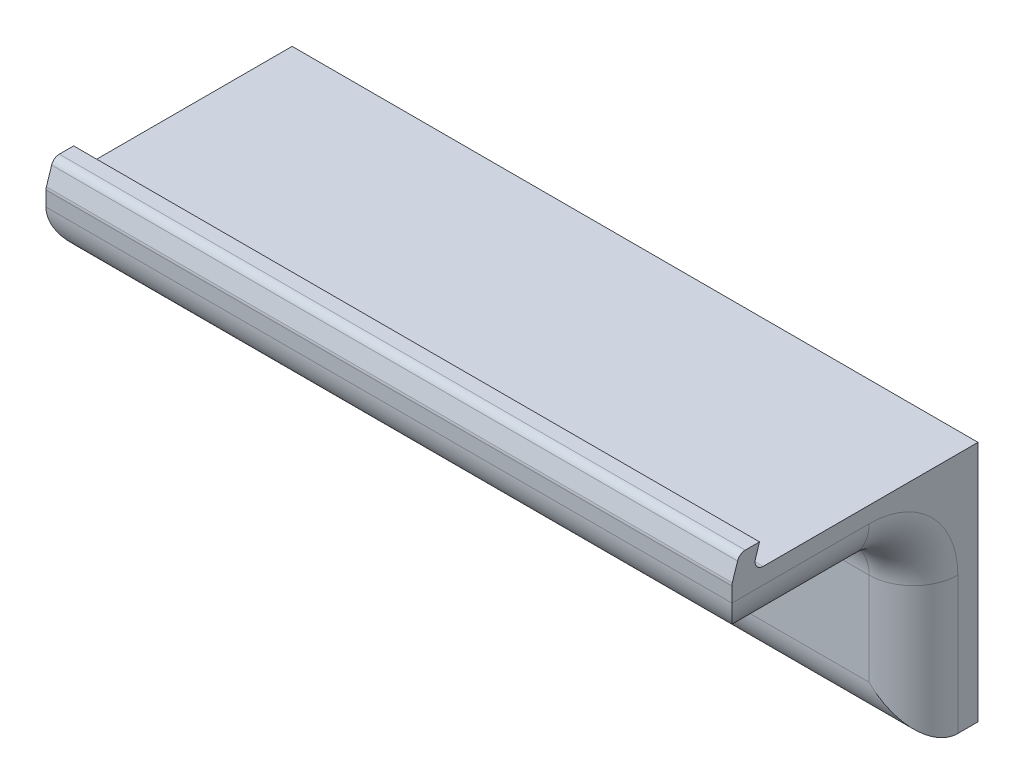
ISO-10303-21;
HEADER;
FILE_DESCRIPTION(('STEP AP214'),'2;1');
FILE_NAME('part.step','',(''),(''),'','','');
FILE_SCHEMA(('AUTOMOTIVE_DESIGN { 1 0 10303 214 1 1 1 1 }'));
ENDSEC;
DATA;
#1=APPLICATION_CONTEXT('core data for automotive mechanical design processes');
#2=APPLICATION_PROTOCOL_DEFINITION('international standard','automotive_design',2000,#1);
#3=PRODUCT_CONTEXT('',#1,'mechanical');
#4=PRODUCT('Part','Part','',(#3));
#5=PRODUCT_RELATED_PRODUCT_CATEGORY('part','',(#4));
#6=PRODUCT_DEFINITION_FORMATION('','',#4);
#7=PRODUCT_DEFINITION_CONTEXT('part definition',#1,'design');
#8=PRODUCT_DEFINITION('design','',#6,#7);
#9=PRODUCT_DEFINITION_SHAPE('','',#8);
#10=(LENGTH_UNIT() NAMED_UNIT(*) SI_UNIT(.MILLI.,.METRE.));
#11=(NAMED_UNIT(*) PLANE_ANGLE_UNIT() SI_UNIT($,.RADIAN.));
#12=(NAMED_UNIT(*) SI_UNIT($,.STERADIAN.) SOLID_ANGLE_UNIT());
#13=UNCERTAINTY_MEASURE_WITH_UNIT(LENGTH_MEASURE(1.E-05),#10,'distance_accuracy_value','');
#14=(GEOMETRIC_REPRESENTATION_CONTEXT(3) GLOBAL_UNCERTAINTY_ASSIGNED_CONTEXT((#13)) GLOBAL_UNIT_ASSIGNED_CONTEXT((#10,
#11,#12)) REPRESENTATION_CONTEXT('',''));
#15=CARTESIAN_POINT('',(0.,0.,0.));
#16=DIRECTION('',(0.,0.,1.));
#17=DIRECTION('',(1.,0.,0.));
#18=AXIS2_PLACEMENT_3D('',#15,#16,#17);
#19=CARTESIAN_POINT('',(-42.5,15.,8.));
#20=DIRECTION('',(0.,-1.,0.));
#21=DIRECTION('',(0.,0.,-1.));
#22=AXIS2_PLACEMENT_3D('',#19,#20,#21);
#23=PLANE('',#22);
#24=DIRECTION('',(0.,0.,-1.));
#25=VECTOR('',#24,1.);
#26=CARTESIAN_POINT('',(-42.5,15.,8.));
#27=LINE('',#26,#25);
#28=CARTESIAN_POINT('',(-42.5,15.,26.6236180795288));
#29=VERTEX_POINT('',#28);
#30=CARTESIAN_POINT('',(-42.5,15.,0.));
#31=VERTEX_POINT('',#30);
#32=EDGE_CURVE('E246',#29,#31,#27,.T.);
#33=ORIENTED_EDGE('',*,*,#32,.F.);
#34=DIRECTION('',(-1.,0.,0.));
#35=VECTOR('',#34,1.);
#36=CARTESIAN_POINT('',(-42.5,15.,26.6236180795288));
#37=LINE('',#36,#35);
#38=CARTESIAN_POINT('',(42.5,15.,26.6236180795288));
#39=VERTEX_POINT('',#38);
#40=EDGE_CURVE('E346',#29,#39,#37,.F.);
#41=ORIENTED_EDGE('',*,*,#40,.T.);
#42=DIRECTION('',(0.,0.,-1.));
#43=VECTOR('',#42,1.);
#44=CARTESIAN_POINT('',(42.5,15.,8.));
#45=LINE('',#44,#43);
#46=CARTESIAN_POINT('',(42.5,15.,0.));
#47=VERTEX_POINT('',#46);
#48=EDGE_CURVE('E249',#39,#47,#45,.T.);
#49=ORIENTED_EDGE('',*,*,#48,.T.);
#50=DIRECTION('',(-1.,0.,0.));
#51=VECTOR('',#50,1.);
#52=CARTESIAN_POINT('',(-42.5,15.,0.));
#53=LINE('',#52,#51);
#54=EDGE_CURVE('E228',#47,#31,#53,.T.);
#55=ORIENTED_EDGE('',*,*,#54,.T.);
#56=EDGE_LOOP('',(#33,#41,#49,#55));
#57=FACE_BOUND('',#56,.T.);
#58=ADVANCED_FACE('F41',(#57),#23,.F.);
#59=CARTESIAN_POINT('',(0.,0.,8.));
#60=DIRECTION('',(0.,0.,-1.));
#61=DIRECTION('',(-1.,0.,0.));
#62=AXIS2_PLACEMENT_3D('',#59,#60,#61);
#63=PLANE('',#62);
#64=DIRECTION('',(1.,0.,0.));
#65=VECTOR('',#64,1.);
#66=CARTESIAN_POINT('',(-42.5,2.,8.));
#67=LINE('',#66,#65);
#68=CARTESIAN_POINT('',(37.,2.,8.));
#69=VERTEX_POINT('',#68);
#70=CARTESIAN_POINT('',(-37.,2.,8.));
#71=VERTEX_POINT('',#70);
#72=EDGE_CURVE('E276',#69,#71,#67,.F.);
#73=ORIENTED_EDGE('',*,*,#72,.T.);
#74=DIRECTION('',(0.,-1.,0.));
#75=VECTOR('',#74,1.);
#76=CARTESIAN_POINT('',(-37.,0.,8.));
#77=LINE('',#76,#75);
#78=CARTESIAN_POINT('',(-37.,-9.5,8.));
#79=VERTEX_POINT('',#78);
#80=EDGE_CURVE('E285',#71,#79,#77,.T.);
#81=ORIENTED_EDGE('',*,*,#80,.T.);
#82=DIRECTION('',(1.,0.,0.));
#83=VECTOR('',#82,1.);
#84=CARTESIAN_POINT('',(0.,-9.5,8.));
#85=LINE('',#84,#83);
#86=CARTESIAN_POINT('',(37.,-9.5,8.));
#87=VERTEX_POINT('',#86);
#88=EDGE_CURVE('E282',#79,#87,#85,.T.);
#89=ORIENTED_EDGE('',*,*,#88,.T.);
#90=DIRECTION('',(0.,1.,0.));
#91=VECTOR('',#90,1.);
#92=CARTESIAN_POINT('',(37.,0.,8.));
#93=LINE('',#92,#91);
#94=EDGE_CURVE('E279',#87,#69,#93,.T.);
#95=ORIENTED_EDGE('',*,*,#94,.T.);
#96=EDGE_LOOP('',(#73,#81,#89,#95));
#97=FACE_BOUND('',#96,.T.);
#98=CARTESIAN_POINT('',(-22.5,-3.75,8.));
#99=DIRECTION('',(0.,0.,1.));
#100=DIRECTION('',(1.,0.,0.));
#101=AXIS2_PLACEMENT_3D('',#98,#99,#100);
#102=CIRCLE('',#101,3.15);
#103=CARTESIAN_POINT('',(-19.35,-3.75,8.));
#104=VERTEX_POINT('',#103);
#105=EDGE_CURVE('E193',#104,#104,#102,.T.);
#106=ORIENTED_EDGE('',*,*,#105,.F.);
#107=EDGE_LOOP('',(#106));
#108=FACE_BOUND('',#107,.T.);
#109=CARTESIAN_POINT('',(22.5,-3.75,8.));
#110=DIRECTION('',(0.,0.,1.));
#111=DIRECTION('',(1.,0.,0.));
#112=AXIS2_PLACEMENT_3D('',#109,#110,#111);
#113=CIRCLE('',#112,3.15);
#114=CARTESIAN_POINT('',(25.65,-3.75,8.));
#115=VERTEX_POINT('',#114);
#116=EDGE_CURVE('E206',#115,#115,#113,.T.);
#117=ORIENTED_EDGE('',*,*,#116,.F.);
#118=EDGE_LOOP('',(#117));
#119=FACE_BOUND('',#118,.T.);
#120=ADVANCED_FACE('F392',(#97,#108,#119),#63,.F.);
#121=CARTESIAN_POINT('',(42.5,-15.,8.));
#122=DIRECTION('',(-1.,0.,0.));
#123=DIRECTION('',(0.,0.,1.));
#124=AXIS2_PLACEMENT_3D('',#121,#122,#123);
#125=PLANE('',#124);
#126=DIRECTION('',(0.,0.,1.));
#127=VECTOR('',#126,1.);
#128=CARTESIAN_POINT('',(42.5,17.8531695488855,27.0729490168752));
#129=LINE('',#128,#127);
#130=CARTESIAN_POINT('',(42.5,17.8531695488855,27.0729490168752));
#131=VERTEX_POINT('',#130);
#132=CARTESIAN_POINT('',(42.5,17.8531695488855,28.8464064888698));
#133=VERTEX_POINT('',#132);
#134=EDGE_CURVE('E177',#131,#133,#129,.T.);
#135=ORIENTED_EDGE('',*,*,#134,.T.);
#136=CARTESIAN_POINT('',(42.5,16.8531695488855,28.8464064888698));
#137=DIRECTION('',(-1.,0.,0.));
#138=DIRECTION('',(0.,0.,1.));
#139=AXIS2_PLACEMENT_3D('',#136,#137,#138);
#140=CIRCLE('',#139,1.);
#141=CARTESIAN_POINT('',(42.5,17.1621865432604,29.797463005165));
#142=VERTEX_POINT('',#141);
#143=EDGE_CURVE('E50',#133,#142,#140,.F.);
#144=ORIENTED_EDGE('',*,*,#143,.T.);
#145=DIRECTION('',(0.,-0.951056516295155,0.309016994374945));
#146=VECTOR('',#145,1.);
#147=CARTESIAN_POINT('',(42.5,15.,30.5));
#148=LINE('',#147,#146);
#149=CARTESIAN_POINT('',(42.5,15.1506325540504,30.4510565162952));
#150=VERTEX_POINT('',#149);
#151=EDGE_CURVE('E190',#142,#150,#148,.T.);
#152=ORIENTED_EDGE('',*,*,#151,.T.);
#153=CARTESIAN_POINT('',(42.5,14.8416155596755,29.5));
#154=DIRECTION('',(-1.,0.,0.));
#155=DIRECTION('',(0.,0.,1.));
#156=AXIS2_PLACEMENT_3D('',#153,#154,#155);
#157=CIRCLE('',#156,1.);
#158=CARTESIAN_POINT('',(42.5,14.8416155596755,30.5));
#159=VERTEX_POINT('',#158);
#160=EDGE_CURVE('E57',#150,#159,#157,.F.);
#161=ORIENTED_EDGE('',*,*,#160,.T.);
#162=DIRECTION('',(0.,1.,0.));
#163=VECTOR('',#162,1.);
#164=CARTESIAN_POINT('',(42.5,15.,30.5));
#165=LINE('',#164,#163);
#166=CARTESIAN_POINT('',(42.5,13.,30.5));
#167=VERTEX_POINT('',#166);
#168=EDGE_CURVE('E221',#167,#159,#165,.T.);
#169=ORIENTED_EDGE('',*,*,#168,.F.);
#170=DIRECTION('',(0.,0.,-1.));
#171=VECTOR('',#170,1.);
#172=CARTESIAN_POINT('',(42.5,13.,8.));
#173=LINE('',#172,#171);
#174=CARTESIAN_POINT('',(42.5,13.,13.5));
#175=VERTEX_POINT('',#174);
#176=EDGE_CURVE('E259',#167,#175,#173,.T.);
#177=ORIENTED_EDGE('',*,*,#176,.T.);
#178=CARTESIAN_POINT('',(42.5,2.,13.5));
#179=DIRECTION('',(-1.,0.,0.));
#180=DIRECTION('',(0.,0.,1.));
#181=AXIS2_PLACEMENT_3D('',#178,#179,#180);
#182=CIRCLE('',#181,11.);
#183=CARTESIAN_POINT('',(42.5,2.,2.5));
#184=VERTEX_POINT('',#183);
#185=EDGE_CURVE('E255',#184,#175,#182,.F.);
#186=ORIENTED_EDGE('',*,*,#185,.F.);
#187=DIRECTION('',(0.,1.,0.));
#188=VECTOR('',#187,1.);
#189=CARTESIAN_POINT('',(42.5,-15.,2.5));
#190=LINE('',#189,#188);
#191=CARTESIAN_POINT('',(42.5,-15.,2.5));
#192=VERTEX_POINT('',#191);
#193=EDGE_CURVE('E252',#184,#192,#190,.F.);
#194=ORIENTED_EDGE('',*,*,#193,.T.);
#195=DIRECTION('',(0.,0.,-1.));
#196=VECTOR('',#195,1.);
#197=CARTESIAN_POINT('',(42.5,-15.,8.));
#198=LINE('',#197,#196);
#199=CARTESIAN_POINT('',(42.5,-15.,0.));
#200=VERTEX_POINT('',#199);
#201=EDGE_CURVE('E240',#192,#200,#198,.T.);
#202=ORIENTED_EDGE('',*,*,#201,.T.);
#203=DIRECTION('',(0.,1.,0.));
#204=VECTOR('',#203,1.);
#205=CARTESIAN_POINT('',(42.5,-15.,0.));
#206=LINE('',#205,#204);
#207=EDGE_CURVE('E224',#200,#47,#206,.T.);
#208=ORIENTED_EDGE('',*,*,#207,.T.);
#209=ORIENTED_EDGE('',*,*,#48,.F.);
#210=CARTESIAN_POINT('',(42.5,16.,26.6236180795288));
#211=DIRECTION('',(-1.,0.,0.));
#212=DIRECTION('',(0.,0.,1.));
#213=AXIS2_PLACEMENT_3D('',#210,#211,#212);
#214=CIRCLE('',#213,1.);
#215=CARTESIAN_POINT('',(42.5,16.3090169943749,27.574674595824));
#216=VERTEX_POINT('',#215);
#217=EDGE_CURVE('E352',#39,#216,#214,.T.);
#218=ORIENTED_EDGE('',*,*,#217,.T.);
#219=DIRECTION('',(0.,0.951056516295154,-0.309016994374946));
#220=VECTOR('',#219,1.);
#221=CARTESIAN_POINT('',(42.5,15.,28.));
#222=LINE('',#221,#220);
#223=EDGE_CURVE('E194',#216,#131,#222,.T.);
#224=ORIENTED_EDGE('',*,*,#223,.T.);
#225=EDGE_LOOP('',(#135,#144,#152,#161,#169,#177,#186,#194,#202,#208,#209,#218,#224));
#226=FACE_BOUND('',#225,.T.);
#227=ADVANCED_FACE('F373',(#226),#125,.F.);
#228=CARTESIAN_POINT('',(-42.5,-15.,8.));
#229=DIRECTION('',(1.,0.,0.));
#230=DIRECTION('',(0.,0.,-1.));
#231=AXIS2_PLACEMENT_3D('',#228,#229,#230);
#232=PLANE('',#231);
#233=DIRECTION('',(0.,0.951056516295154,-0.309016994374945));
#234=VECTOR('',#233,1.);
#235=CARTESIAN_POINT('',(-42.5,15.,30.5));
#236=LINE('',#235,#234);
#237=CARTESIAN_POINT('',(-42.5,15.1506325540504,30.4510565162952));
#238=VERTEX_POINT('',#237);
#239=CARTESIAN_POINT('',(-42.5,17.1621865432604,29.797463005165));
#240=VERTEX_POINT('',#239);
#241=EDGE_CURVE('E172',#238,#240,#236,.T.);
#242=ORIENTED_EDGE('',*,*,#241,.T.);
#243=CARTESIAN_POINT('',(-42.5,16.8531695488855,28.8464064888698));
#244=DIRECTION('',(1.,0.,0.));
#245=DIRECTION('',(0.,0.,-1.));
#246=AXIS2_PLACEMENT_3D('',#243,#244,#245);
#247=CIRCLE('',#246,1.);
#248=CARTESIAN_POINT('',(-42.5,17.8531695488855,28.8464064888698));
#249=VERTEX_POINT('',#248);
#250=EDGE_CURVE('E170',#240,#249,#247,.F.);
#251=ORIENTED_EDGE('',*,*,#250,.T.);
#252=DIRECTION('',(0.,0.,-1.));
#253=VECTOR('',#252,1.);
#254=CARTESIAN_POINT('',(-42.5,17.8531695488855,27.0729490168752));
#255=LINE('',#254,#253);
#256=CARTESIAN_POINT('',(-42.5,17.8531695488855,27.0729490168752));
#257=VERTEX_POINT('',#256);
#258=EDGE_CURVE('E164',#249,#257,#255,.T.);
#259=ORIENTED_EDGE('',*,*,#258,.T.);
#260=DIRECTION('',(0.,-0.951056516295154,0.309016994374946));
#261=VECTOR('',#260,1.);
#262=CARTESIAN_POINT('',(-42.5,15.,28.));
#263=LINE('',#262,#261);
#264=CARTESIAN_POINT('',(-42.5,16.3090169943749,27.574674595824));
#265=VERTEX_POINT('',#264);
#266=EDGE_CURVE('E169',#257,#265,#263,.T.);
#267=ORIENTED_EDGE('',*,*,#266,.T.);
#268=CARTESIAN_POINT('',(-42.5,16.,26.6236180795288));
#269=DIRECTION('',(1.,0.,0.));
#270=DIRECTION('',(0.,0.,-1.));
#271=AXIS2_PLACEMENT_3D('',#268,#269,#270);
#272=CIRCLE('',#271,1.);
#273=EDGE_CURVE('E349',#265,#29,#272,.T.);
#274=ORIENTED_EDGE('',*,*,#273,.T.);
#275=ORIENTED_EDGE('',*,*,#32,.T.);
#276=DIRECTION('',(0.,-1.,0.));
#277=VECTOR('',#276,1.);
#278=CARTESIAN_POINT('',(-42.5,-15.,0.));
#279=LINE('',#278,#277);
#280=CARTESIAN_POINT('',(-42.5,-15.,0.));
#281=VERTEX_POINT('',#280);
#282=EDGE_CURVE('E232',#31,#281,#279,.T.);
#283=ORIENTED_EDGE('',*,*,#282,.T.);
#284=DIRECTION('',(0.,0.,-1.));
#285=VECTOR('',#284,1.);
#286=CARTESIAN_POINT('',(-42.5,-15.,8.));
#287=LINE('',#286,#285);
#288=CARTESIAN_POINT('',(-42.5,-15.,2.5));
#289=VERTEX_POINT('',#288);
#290=EDGE_CURVE('E243',#289,#281,#287,.T.);
#291=ORIENTED_EDGE('',*,*,#290,.F.);
#292=DIRECTION('',(0.,-1.,0.));
#293=VECTOR('',#292,1.);
#294=CARTESIAN_POINT('',(-42.5,-15.,2.5));
#295=LINE('',#294,#293);
#296=CARTESIAN_POINT('',(-42.5,2.,2.5));
#297=VERTEX_POINT('',#296);
#298=EDGE_CURVE('E297',#289,#297,#295,.F.);
#299=ORIENTED_EDGE('',*,*,#298,.T.);
#300=CARTESIAN_POINT('',(-42.5,2.,13.5));
#301=DIRECTION('',(1.,0.,0.));
#302=DIRECTION('',(0.,0.,-1.));
#303=AXIS2_PLACEMENT_3D('',#300,#301,#302);
#304=CIRCLE('',#303,11.);
#305=CARTESIAN_POINT('',(-42.5,13.,13.5));
#306=VERTEX_POINT('',#305);
#307=EDGE_CURVE('E293',#306,#297,#304,.F.);
#308=ORIENTED_EDGE('',*,*,#307,.F.);
#309=DIRECTION('',(0.,0.,-1.));
#310=VECTOR('',#309,1.);
#311=CARTESIAN_POINT('',(-42.5,13.,8.));
#312=LINE('',#311,#310);
#313=CARTESIAN_POINT('',(-42.5,13.,30.5));
#314=VERTEX_POINT('',#313);
#315=EDGE_CURVE('E289',#306,#314,#312,.F.);
#316=ORIENTED_EDGE('',*,*,#315,.T.);
#317=DIRECTION('',(0.,-1.,0.));
#318=VECTOR('',#317,1.);
#319=CARTESIAN_POINT('',(-42.5,15.,30.5));
#320=LINE('',#319,#318);
#321=CARTESIAN_POINT('',(-42.5,14.8416155596755,30.5));
#322=VERTEX_POINT('',#321);
#323=EDGE_CURVE('E218',#322,#314,#320,.T.);
#324=ORIENTED_EDGE('',*,*,#323,.F.);
#325=CARTESIAN_POINT('',(-42.5,14.8416155596755,29.5));
#326=DIRECTION('',(1.,0.,0.));
#327=DIRECTION('',(0.,0.,-1.));
#328=AXIS2_PLACEMENT_3D('',#325,#326,#327);
#329=CIRCLE('',#328,1.);
#330=EDGE_CURVE('E362',#322,#238,#329,.F.);
#331=ORIENTED_EDGE('',*,*,#330,.T.);
#332=EDGE_LOOP('',(#242,#251,#259,#267,#274,#275,#283,#291,#299,#308,#316,#324,#331));
#333=FACE_BOUND('',#332,.T.);
#334=ADVANCED_FACE('F167',(#333),#232,.F.);
#335=CARTESIAN_POINT('',(-42.5,-15.,8.));
#336=DIRECTION('',(0.,1.,0.));
#337=DIRECTION('',(0.,0.,1.));
#338=AXIS2_PLACEMENT_3D('',#335,#336,#337);
#339=PLANE('',#338);
#340=ORIENTED_EDGE('',*,*,#201,.F.);
#341=DIRECTION('',(1.,0.,0.));
#342=VECTOR('',#341,1.);
#343=CARTESIAN_POINT('',(-42.5,-15.,2.5));
#344=LINE('',#343,#342);
#345=EDGE_CURVE('E300',#192,#289,#344,.F.);
#346=ORIENTED_EDGE('',*,*,#345,.T.);
#347=ORIENTED_EDGE('',*,*,#290,.T.);
#348=DIRECTION('',(1.,0.,0.));
#349=VECTOR('',#348,1.);
#350=CARTESIAN_POINT('',(-42.5,-15.,0.));
#351=LINE('',#350,#349);
#352=EDGE_CURVE('E236',#281,#200,#351,.T.);
#353=ORIENTED_EDGE('',*,*,#352,.T.);
#354=EDGE_LOOP('',(#340,#346,#347,#353));
#355=FACE_BOUND('',#354,.T.);
#356=ADVANCED_FACE('F458',(#355),#339,.F.);
#357=CARTESIAN_POINT('',(0.,0.,0.));
#358=DIRECTION('',(0.,0.,-1.));
#359=DIRECTION('',(-1.,0.,0.));
#360=AXIS2_PLACEMENT_3D('',#357,#358,#359);
#361=PLANE('',#360);
#362=CARTESIAN_POINT('',(-22.5,-3.75,0.));
#363=DIRECTION('',(0.,0.,1.));
#364=DIRECTION('',(1.,0.,0.));
#365=AXIS2_PLACEMENT_3D('',#362,#363,#364);
#366=CIRCLE('',#365,1.7);
#367=CARTESIAN_POINT('',(-20.8,-3.75,0.));
#368=VERTEX_POINT('',#367);
#369=EDGE_CURVE('E202',#368,#368,#366,.T.);
#370=ORIENTED_EDGE('',*,*,#369,.T.);
#371=EDGE_LOOP('',(#370));
#372=FACE_BOUND('',#371,.T.);
#373=CARTESIAN_POINT('',(22.5,-3.75,0.));
#374=DIRECTION('',(0.,0.,1.));
#375=DIRECTION('',(1.,0.,0.));
#376=AXIS2_PLACEMENT_3D('',#373,#374,#375);
#377=CIRCLE('',#376,1.7);
#378=CARTESIAN_POINT('',(24.2,-3.75,0.));
#379=VERTEX_POINT('',#378);
#380=EDGE_CURVE('E214',#379,#379,#377,.T.);
#381=ORIENTED_EDGE('',*,*,#380,.T.);
#382=EDGE_LOOP('',(#381));
#383=FACE_BOUND('',#382,.T.);
#384=ORIENTED_EDGE('',*,*,#207,.F.);
#385=ORIENTED_EDGE('',*,*,#352,.F.);
#386=ORIENTED_EDGE('',*,*,#282,.F.);
#387=ORIENTED_EDGE('',*,*,#54,.F.);
#388=EDGE_LOOP('',(#384,#385,#386,#387));
#389=FACE_BOUND('',#388,.T.);
#390=ADVANCED_FACE('F485',(#372,#383,#389),#361,.T.);
#391=CARTESIAN_POINT('',(-42.5,7.5,30.5));
#392=DIRECTION('',(0.,1.,0.));
#393=DIRECTION('',(0.,0.,1.));
#394=AXIS2_PLACEMENT_3D('',#391,#392,#393);
#395=PLANE('',#394);
#396=DIRECTION('',(0.,0.,-1.));
#397=VECTOR('',#396,1.);
#398=CARTESIAN_POINT('',(37.,7.5,30.5));
#399=LINE('',#398,#397);
#400=CARTESIAN_POINT('',(37.,7.5,13.5));
#401=VERTEX_POINT('',#400);
#402=CARTESIAN_POINT('',(37.,7.5,25.));
#403=VERTEX_POINT('',#402);
#404=EDGE_CURVE('E269',#401,#403,#399,.F.);
#405=ORIENTED_EDGE('',*,*,#404,.T.);
#406=DIRECTION('',(1.,0.,0.));
#407=VECTOR('',#406,1.);
#408=CARTESIAN_POINT('',(-42.5,7.5,25.));
#409=LINE('',#408,#407);
#410=CARTESIAN_POINT('',(-37.,7.5,25.));
#411=VERTEX_POINT('',#410);
#412=EDGE_CURVE('E273',#403,#411,#409,.F.);
#413=ORIENTED_EDGE('',*,*,#412,.T.);
#414=DIRECTION('',(0.,0.,-1.));
#415=VECTOR('',#414,1.);
#416=CARTESIAN_POINT('',(-37.,7.5,30.5));
#417=LINE('',#416,#415);
#418=CARTESIAN_POINT('',(-37.,7.5,13.5));
#419=VERTEX_POINT('',#418);
#420=EDGE_CURVE('E266',#411,#419,#417,.T.);
#421=ORIENTED_EDGE('',*,*,#420,.T.);
#422=DIRECTION('',(1.,0.,0.));
#423=VECTOR('',#422,1.);
#424=CARTESIAN_POINT('',(42.5,7.5,13.5));
#425=LINE('',#424,#423);
#426=EDGE_CURVE('E263',#419,#401,#425,.T.);
#427=ORIENTED_EDGE('',*,*,#426,.T.);
#428=EDGE_LOOP('',(#405,#413,#421,#427));
#429=FACE_BOUND('',#428,.T.);
#430=ADVANCED_FACE('F471',(#429),#395,.F.);
#431=CARTESIAN_POINT('',(0.,0.,30.5));
#432=DIRECTION('',(0.,0.,1.));
#433=DIRECTION('',(1.,0.,0.));
#434=AXIS2_PLACEMENT_3D('',#431,#432,#433);
#435=PLANE('',#434);
#436=ORIENTED_EDGE('',*,*,#168,.T.);
#437=DIRECTION('',(-1.,0.,0.));
#438=VECTOR('',#437,1.);
#439=CARTESIAN_POINT('',(0.,14.8416155596755,30.5));
#440=LINE('',#439,#438);
#441=EDGE_CURVE('E11',#159,#322,#440,.T.);
#442=ORIENTED_EDGE('',*,*,#441,.T.);
#443=ORIENTED_EDGE('',*,*,#323,.T.);
#444=DIRECTION('',(1.,0.,0.));
#445=VECTOR('',#444,1.);
#446=CARTESIAN_POINT('',(42.5,13.,30.5));
#447=LINE('',#446,#445);
#448=EDGE_CURVE('E303',#314,#167,#447,.T.);
#449=ORIENTED_EDGE('',*,*,#448,.T.);
#450=EDGE_LOOP('',(#436,#442,#443,#449));
#451=FACE_BOUND('',#450,.T.);
#452=ADVANCED_FACE('F478',(#451),#435,.T.);
#453=CARTESIAN_POINT('',(22.5,-3.75,8.));
#454=DIRECTION('',(0.,0.,1.));
#455=DIRECTION('',(1.,0.,0.));
#456=AXIS2_PLACEMENT_3D('',#453,#454,#455);
#457=CYLINDRICAL_SURFACE('',#456,1.7);
#458=ORIENTED_EDGE('',*,*,#380,.F.);
#459=EDGE_LOOP('',(#458));
#460=FACE_BOUND('',#459,.T.);
#461=CARTESIAN_POINT('',(22.5,-3.75,6.55));
#462=DIRECTION('',(0.,0.,1.));
#463=DIRECTION('',(1.,0.,0.));
#464=AXIS2_PLACEMENT_3D('',#461,#462,#463);
#465=CIRCLE('',#464,1.7);
#466=CARTESIAN_POINT('',(24.2,-3.75,6.55));
#467=VERTEX_POINT('',#466);
#468=EDGE_CURVE('E210',#467,#467,#465,.T.);
#469=ORIENTED_EDGE('',*,*,#468,.T.);
#470=EDGE_LOOP('',(#469));
#471=FACE_BOUND('',#470,.T.);
#472=ADVANCED_FACE('F504',(#460,#471),#457,.F.);
#473=CARTESIAN_POINT('',(22.5,-3.75,8.));
#474=DIRECTION('',(0.,0.,1.));
#475=DIRECTION('',(1.,0.,0.));
#476=AXIS2_PLACEMENT_3D('',#473,#474,#475);
#477=CONICAL_SURFACE('',#476,3.15,0.785398163397448);
#478=ORIENTED_EDGE('',*,*,#468,.F.);
#479=EDGE_LOOP('',(#478));
#480=FACE_BOUND('',#479,.T.);
#481=ORIENTED_EDGE('',*,*,#116,.T.);
#482=EDGE_LOOP('',(#481));
#483=FACE_BOUND('',#482,.T.);
#484=ADVANCED_FACE('F507',(#480,#483),#477,.F.);
#485=CARTESIAN_POINT('',(-22.5,-3.75,8.));
#486=DIRECTION('',(0.,0.,1.));
#487=DIRECTION('',(1.,0.,0.));
#488=AXIS2_PLACEMENT_3D('',#485,#486,#487);
#489=CYLINDRICAL_SURFACE('',#488,1.7);
#490=ORIENTED_EDGE('',*,*,#369,.F.);
#491=EDGE_LOOP('',(#490));
#492=FACE_BOUND('',#491,.T.);
#493=CARTESIAN_POINT('',(-22.5,-3.75,6.55));
#494=DIRECTION('',(0.,0.,1.));
#495=DIRECTION('',(1.,0.,0.));
#496=AXIS2_PLACEMENT_3D('',#493,#494,#495);
#497=CIRCLE('',#496,1.7);
#498=CARTESIAN_POINT('',(-20.8,-3.75,6.55));
#499=VERTEX_POINT('',#498);
#500=EDGE_CURVE('E198',#499,#499,#497,.T.);
#501=ORIENTED_EDGE('',*,*,#500,.T.);
#502=EDGE_LOOP('',(#501));
#503=FACE_BOUND('',#502,.T.);
#504=ADVANCED_FACE('F511',(#492,#503),#489,.F.);
#505=CARTESIAN_POINT('',(-22.5,-3.75,8.));
#506=DIRECTION('',(0.,0.,1.));
#507=DIRECTION('',(1.,0.,0.));
#508=AXIS2_PLACEMENT_3D('',#505,#506,#507);
#509=CONICAL_SURFACE('',#508,3.15,0.785398163397448);
#510=ORIENTED_EDGE('',*,*,#500,.F.);
#511=EDGE_LOOP('',(#510));
#512=FACE_BOUND('',#511,.T.);
#513=ORIENTED_EDGE('',*,*,#105,.T.);
#514=EDGE_LOOP('',(#513));
#515=FACE_BOUND('',#514,.T.);
#516=ADVANCED_FACE('F515',(#512,#515),#509,.F.);
#517=CARTESIAN_POINT('',(46.9592886109361,15.,28.));
#518=DIRECTION('',(0.,-0.309016994374946,-0.951056516295154));
#519=DIRECTION('',(0.,0.951056516295154,-0.309016994374946));
#520=AXIS2_PLACEMENT_3D('',#517,#518,#519);
#521=PLANE('',#520);
#522=ORIENTED_EDGE('',*,*,#223,.F.);
#523=DIRECTION('',(-1.,0.,0.));
#524=VECTOR('',#523,1.);
#525=CARTESIAN_POINT('',(46.9592886109361,16.3090169943749,27.574674595824));
#526=LINE('',#525,#524);
#527=EDGE_CURVE('E185',#216,#265,#526,.T.);
#528=ORIENTED_EDGE('',*,*,#527,.T.);
#529=ORIENTED_EDGE('',*,*,#266,.F.);
#530=DIRECTION('',(-1.,0.,0.));
#531=VECTOR('',#530,1.);
#532=CARTESIAN_POINT('',(46.9592886109361,17.8531695488855,27.0729490168752));
#533=LINE('',#532,#531);
#534=EDGE_CURVE('E175',#131,#257,#533,.T.);
#535=ORIENTED_EDGE('',*,*,#534,.F.);
#536=EDGE_LOOP('',(#522,#528,#529,#535));
#537=FACE_BOUND('',#536,.T.);
#538=ADVANCED_FACE('F183',(#537),#521,.T.);
#539=CARTESIAN_POINT('',(46.9592886109361,17.8531695488855,27.0729490168752));
#540=DIRECTION('',(0.,1.,0.));
#541=DIRECTION('',(0.,0.,1.));
#542=AXIS2_PLACEMENT_3D('',#539,#540,#541);
#543=PLANE('',#542);
#544=ORIENTED_EDGE('',*,*,#258,.F.);
#545=DIRECTION('',(-1.,0.,0.));
#546=VECTOR('',#545,1.);
#547=CARTESIAN_POINT('',(46.9592886109361,17.8531695488855,28.8464064888698));
#548=LINE('',#547,#546);
#549=EDGE_CURVE('E65',#249,#133,#548,.F.);
#550=ORIENTED_EDGE('',*,*,#549,.T.);
#551=ORIENTED_EDGE('',*,*,#134,.F.);
#552=ORIENTED_EDGE('',*,*,#534,.T.);
#553=EDGE_LOOP('',(#544,#550,#551,#552));
#554=FACE_BOUND('',#553,.T.);
#555=ADVANCED_FACE('F176',(#554),#543,.T.);
#556=CARTESIAN_POINT('',(46.9592886109361,15.,30.5));
#557=DIRECTION('',(0.,0.309016994374945,0.951056516295155));
#558=DIRECTION('',(0.,-0.951056516295155,0.309016994374945));
#559=AXIS2_PLACEMENT_3D('',#556,#557,#558);
#560=PLANE('',#559);
#561=ORIENTED_EDGE('',*,*,#151,.F.);
#562=DIRECTION('',(-1.,0.,0.));
#563=VECTOR('',#562,1.);
#564=CARTESIAN_POINT('',(46.9592886109361,17.1621865432604,29.797463005165));
#565=LINE('',#564,#563);
#566=EDGE_CURVE('E358',#142,#240,#565,.T.);
#567=ORIENTED_EDGE('',*,*,#566,.T.);
#568=ORIENTED_EDGE('',*,*,#241,.F.);
#569=DIRECTION('',(-1.,0.,0.));
#570=VECTOR('',#569,1.);
#571=CARTESIAN_POINT('',(46.9592886109361,15.1506325540504,30.4510565162952));
#572=LINE('',#571,#570);
#573=EDGE_CURVE('E355',#238,#150,#572,.F.);
#574=ORIENTED_EDGE('',*,*,#573,.T.);
#575=EDGE_LOOP('',(#561,#567,#568,#574));
#576=FACE_BOUND('',#575,.T.);
#577=ADVANCED_FACE('F377',(#576),#560,.T.);
#578=CARTESIAN_POINT('',(-37.,0.,2.5));
#579=DIRECTION('',(0.,-1.,0.));
#580=DIRECTION('',(0.,0.,-1.));
#581=AXIS2_PLACEMENT_3D('',#578,#579,#580);
#582=CYLINDRICAL_SURFACE('',#581,5.5);
#583=CARTESIAN_POINT('',(-37.,2.,2.5));
#584=DIRECTION('',(0.,1.,0.));
#585=DIRECTION('',(0.,0.,1.));
#586=AXIS2_PLACEMENT_3D('',#583,#584,#585);
#587=CIRCLE('',#586,5.5);
#588=EDGE_CURVE('E336',#297,#71,#587,.T.);
#589=ORIENTED_EDGE('',*,*,#588,.F.);
#590=ORIENTED_EDGE('',*,*,#298,.F.);
#591=CARTESIAN_POINT('',(-37.,-9.5,2.5));
#592=DIRECTION('',(0.707106781186547,-0.707106781186547,0.));
#593=DIRECTION('',(0.707106781186547,0.707106781186547,0.));
#594=AXIS2_PLACEMENT_3D('',#591,#592,#593);
#595=ELLIPSE('',#594,7.77817459305202,5.5);
#596=EDGE_CURVE('E340',#79,#289,#595,.T.);
#597=ORIENTED_EDGE('',*,*,#596,.F.);
#598=ORIENTED_EDGE('',*,*,#80,.F.);
#599=EDGE_LOOP('',(#589,#590,#597,#598));
#600=FACE_BOUND('',#599,.T.);
#601=ADVANCED_FACE('F436',(#600),#582,.T.);
#602=CARTESIAN_POINT('',(0.,-9.5,2.5));
#603=DIRECTION('',(1.,0.,0.));
#604=DIRECTION('',(0.,0.,-1.));
#605=AXIS2_PLACEMENT_3D('',#602,#603,#604);
#606=CYLINDRICAL_SURFACE('',#605,5.5);
#607=ORIENTED_EDGE('',*,*,#596,.T.);
#608=ORIENTED_EDGE('',*,*,#345,.F.);
#609=CARTESIAN_POINT('',(37.,-9.5,2.5));
#610=DIRECTION('',(0.707106781186547,0.707106781186547,0.));
#611=DIRECTION('',(-0.707106781186547,0.707106781186547,0.));
#612=AXIS2_PLACEMENT_3D('',#609,#610,#611);
#613=ELLIPSE('',#612,7.77817459305202,5.5);
#614=EDGE_CURVE('E328',#87,#192,#613,.T.);
#615=ORIENTED_EDGE('',*,*,#614,.F.);
#616=ORIENTED_EDGE('',*,*,#88,.F.);
#617=EDGE_LOOP('',(#607,#608,#615,#616));
#618=FACE_BOUND('',#617,.T.);
#619=ADVANCED_FACE('F432',(#618),#606,.T.);
#620=CARTESIAN_POINT('',(-37.,2.,13.5));
#621=DIRECTION('',(1.,0.,0.));
#622=DIRECTION('',(0.,0.,-1.));
#623=AXIS2_PLACEMENT_3D('',#620,#621,#622);
#624=TOROIDAL_SURFACE('',#623,11.,5.5);
#625=CARTESIAN_POINT('',(-37.,2.,13.5));
#626=DIRECTION('',(1.,0.,0.));
#627=DIRECTION('',(0.,0.,-1.));
#628=AXIS2_PLACEMENT_3D('',#625,#626,#627);
#629=CIRCLE('',#628,5.5);
#630=EDGE_CURVE('E324',#419,#71,#629,.F.);
#631=ORIENTED_EDGE('',*,*,#630,.F.);
#632=CARTESIAN_POINT('',(-37.,13.,13.5));
#633=DIRECTION('',(0.,0.,-1.));
#634=DIRECTION('',(-1.,0.,0.));
#635=AXIS2_PLACEMENT_3D('',#632,#633,#634);
#636=CIRCLE('',#635,5.5);
#637=EDGE_CURVE('E332',#306,#419,#636,.F.);
#638=ORIENTED_EDGE('',*,*,#637,.F.);
#639=ORIENTED_EDGE('',*,*,#307,.T.);
#640=ORIENTED_EDGE('',*,*,#588,.T.);
#641=EDGE_LOOP('',(#631,#638,#639,#640));
#642=FACE_BOUND('',#641,.T.);
#643=ADVANCED_FACE('F428',(#642),#624,.T.);
#644=CARTESIAN_POINT('',(-37.,13.,30.5));
#645=DIRECTION('',(0.,0.,-1.));
#646=DIRECTION('',(-1.,0.,0.));
#647=AXIS2_PLACEMENT_3D('',#644,#645,#646);
#648=CYLINDRICAL_SURFACE('',#647,5.5);
#649=ORIENTED_EDGE('',*,*,#637,.T.);
#650=ORIENTED_EDGE('',*,*,#420,.F.);
#651=CARTESIAN_POINT('',(-37.,13.,25.));
#652=DIRECTION('',(-0.707106781186547,0.,-0.707106781186547));
#653=DIRECTION('',(-0.707106781186547,0.,0.707106781186547));
#654=AXIS2_PLACEMENT_3D('',#651,#652,#653);
#655=ELLIPSE('',#654,7.77817459305202,5.5);
#656=EDGE_CURVE('E320',#314,#411,#655,.F.);
#657=ORIENTED_EDGE('',*,*,#656,.F.);
#658=ORIENTED_EDGE('',*,*,#315,.F.);
#659=EDGE_LOOP('',(#649,#650,#657,#658));
#660=FACE_BOUND('',#659,.T.);
#661=ADVANCED_FACE('F424',(#660),#648,.T.);
#662=CARTESIAN_POINT('',(37.,0.,2.5));
#663=DIRECTION('',(0.,1.,0.));
#664=DIRECTION('',(0.,0.,1.));
#665=AXIS2_PLACEMENT_3D('',#662,#663,#664);
#666=CYLINDRICAL_SURFACE('',#665,5.5);
#667=ORIENTED_EDGE('',*,*,#614,.T.);
#668=ORIENTED_EDGE('',*,*,#193,.F.);
#669=CARTESIAN_POINT('',(37.,2.,2.5));
#670=DIRECTION('',(0.,1.,0.));
#671=DIRECTION('',(0.,0.,1.));
#672=AXIS2_PLACEMENT_3D('',#669,#670,#671);
#673=CIRCLE('',#672,5.5);
#674=EDGE_CURVE('E316',#69,#184,#673,.T.);
#675=ORIENTED_EDGE('',*,*,#674,.F.);
#676=ORIENTED_EDGE('',*,*,#94,.F.);
#677=EDGE_LOOP('',(#667,#668,#675,#676));
#678=FACE_BOUND('',#677,.T.);
#679=ADVANCED_FACE('F420',(#678),#666,.T.);
#680=CARTESIAN_POINT('',(-42.5,2.,13.5));
#681=DIRECTION('',(-1.,0.,0.));
#682=DIRECTION('',(0.,0.,1.));
#683=AXIS2_PLACEMENT_3D('',#680,#681,#682);
#684=CYLINDRICAL_SURFACE('',#683,5.5);
#685=ORIENTED_EDGE('',*,*,#630,.T.);
#686=ORIENTED_EDGE('',*,*,#72,.F.);
#687=CARTESIAN_POINT('',(37.,2.,13.5));
#688=DIRECTION('',(-1.,0.,0.));
#689=DIRECTION('',(0.,0.,1.));
#690=AXIS2_PLACEMENT_3D('',#687,#688,#689);
#691=CIRCLE('',#690,5.5);
#692=EDGE_CURVE('E312',#401,#69,#691,.T.);
#693=ORIENTED_EDGE('',*,*,#692,.F.);
#694=ORIENTED_EDGE('',*,*,#426,.F.);
#695=EDGE_LOOP('',(#685,#686,#693,#694));
#696=FACE_BOUND('',#695,.T.);
#697=ADVANCED_FACE('F416',(#696),#684,.F.);
#698=CARTESIAN_POINT('',(0.,13.,25.));
#699=DIRECTION('',(-1.,0.,0.));
#700=DIRECTION('',(0.,0.,1.));
#701=AXIS2_PLACEMENT_3D('',#698,#699,#700);
#702=CYLINDRICAL_SURFACE('',#701,5.5);
#703=ORIENTED_EDGE('',*,*,#656,.T.);
#704=ORIENTED_EDGE('',*,*,#412,.F.);
#705=CARTESIAN_POINT('',(37.,13.,25.));
#706=DIRECTION('',(-0.707106781186547,0.,0.707106781186547));
#707=DIRECTION('',(-0.707106781186547,0.,-0.707106781186547));
#708=AXIS2_PLACEMENT_3D('',#705,#706,#707);
#709=ELLIPSE('',#708,7.77817459305202,5.5);
#710=EDGE_CURVE('E309',#167,#403,#709,.F.);
#711=ORIENTED_EDGE('',*,*,#710,.F.);
#712=ORIENTED_EDGE('',*,*,#448,.F.);
#713=EDGE_LOOP('',(#703,#704,#711,#712));
#714=FACE_BOUND('',#713,.T.);
#715=ADVANCED_FACE('F412',(#714),#702,.T.);
#716=CARTESIAN_POINT('',(37.,2.,13.5));
#717=DIRECTION('',(-1.,0.,0.));
#718=DIRECTION('',(0.,0.,1.));
#719=AXIS2_PLACEMENT_3D('',#716,#717,#718);
#720=TOROIDAL_SURFACE('',#719,11.,5.5);
#721=ORIENTED_EDGE('',*,*,#674,.T.);
#722=ORIENTED_EDGE('',*,*,#185,.T.);
#723=CARTESIAN_POINT('',(37.,13.,13.5));
#724=DIRECTION('',(0.,0.,-1.));
#725=DIRECTION('',(-1.,0.,0.));
#726=AXIS2_PLACEMENT_3D('',#723,#724,#725);
#727=CIRCLE('',#726,5.5);
#728=EDGE_CURVE('E306',#401,#175,#727,.F.);
#729=ORIENTED_EDGE('',*,*,#728,.F.);
#730=ORIENTED_EDGE('',*,*,#692,.T.);
#731=EDGE_LOOP('',(#721,#722,#729,#730));
#732=FACE_BOUND('',#731,.T.);
#733=ADVANCED_FACE('F408',(#732),#720,.T.);
#734=CARTESIAN_POINT('',(37.,13.,8.));
#735=DIRECTION('',(0.,0.,-1.));
#736=DIRECTION('',(-1.,0.,0.));
#737=AXIS2_PLACEMENT_3D('',#734,#735,#736);
#738=CYLINDRICAL_SURFACE('',#737,5.5);
#739=ORIENTED_EDGE('',*,*,#710,.T.);
#740=ORIENTED_EDGE('',*,*,#404,.F.);
#741=ORIENTED_EDGE('',*,*,#728,.T.);
#742=ORIENTED_EDGE('',*,*,#176,.F.);
#743=EDGE_LOOP('',(#739,#740,#741,#742));
#744=FACE_BOUND('',#743,.T.);
#745=ADVANCED_FACE('F388',(#744),#738,.T.);
#746=CARTESIAN_POINT('',(46.9592886109361,16.,26.6236180795288));
#747=DIRECTION('',(-1.,0.,0.));
#748=DIRECTION('',(0.,0.,1.));
#749=AXIS2_PLACEMENT_3D('',#746,#747,#748);
#750=CYLINDRICAL_SURFACE('',#749,1.);
#751=ORIENTED_EDGE('',*,*,#217,.F.);
#752=ORIENTED_EDGE('',*,*,#40,.F.);
#753=ORIENTED_EDGE('',*,*,#273,.F.);
#754=ORIENTED_EDGE('',*,*,#527,.F.);
#755=EDGE_LOOP('',(#751,#752,#753,#754));
#756=FACE_BOUND('',#755,.T.);
#757=ADVANCED_FACE('F382',(#756),#750,.F.);
#758=CARTESIAN_POINT('',(46.9592886109361,16.8531695488855,28.8464064888698));
#759=DIRECTION('',(-1.,0.,0.));
#760=DIRECTION('',(0.,0.,1.));
#761=AXIS2_PLACEMENT_3D('',#758,#759,#760);
#762=CYLINDRICAL_SURFACE('',#761,1.);
#763=ORIENTED_EDGE('',*,*,#143,.F.);
#764=ORIENTED_EDGE('',*,*,#549,.F.);
#765=ORIENTED_EDGE('',*,*,#250,.F.);
#766=ORIENTED_EDGE('',*,*,#566,.F.);
#767=EDGE_LOOP('',(#763,#764,#765,#766));
#768=FACE_BOUND('',#767,.T.);
#769=ADVANCED_FACE('F380',(#768),#762,.T.);
#770=CARTESIAN_POINT('',(0.,14.8416155596755,29.5));
#771=DIRECTION('',(-1.,0.,0.));
#772=DIRECTION('',(0.,0.,1.));
#773=AXIS2_PLACEMENT_3D('',#770,#771,#772);
#774=CYLINDRICAL_SURFACE('',#773,1.);
#775=ORIENTED_EDGE('',*,*,#160,.F.);
#776=ORIENTED_EDGE('',*,*,#573,.F.);
#777=ORIENTED_EDGE('',*,*,#330,.F.);
#778=ORIENTED_EDGE('',*,*,#441,.F.);
#779=EDGE_LOOP('',(#775,#776,#777,#778));
#780=FACE_BOUND('',#779,.T.);
#781=ADVANCED_FACE('F43',(#780),#774,.T.);
#782=CLOSED_SHELL('',(#58,#120,#227,#334,#356,#390,#430,#452,#472,#484,#504,#516,#538,#555,#577,
#601,#619,#643,#661,#679,#697,#715,#733,#745,#757,#769,#781));
#783=MANIFOLD_SOLID_BREP('B2',#782);
#784=ADVANCED_BREP_SHAPE_REPRESENTATION('',(#18,#783),#14);
#785=SHAPE_DEFINITION_REPRESENTATION(#9,#784);
ENDSEC;
END-ISO-10303-21;
